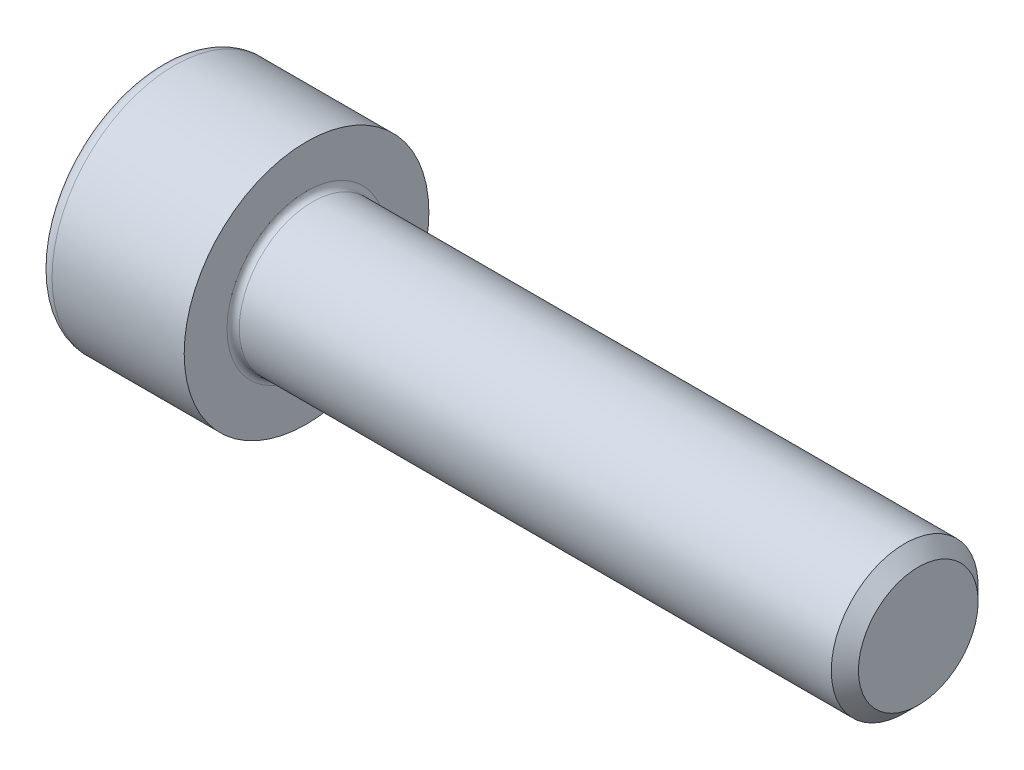
ISO-10303-21;
HEADER;
FILE_DESCRIPTION(('STEP AP214'),'2;1');
FILE_NAME('part.step','',(''),(''),'','','');
FILE_SCHEMA(('AUTOMOTIVE_DESIGN { 1 0 10303 214 1 1 1 1 }'));
ENDSEC;
DATA;
#1=APPLICATION_CONTEXT('core data for automotive mechanical design processes');
#2=APPLICATION_PROTOCOL_DEFINITION('international standard','automotive_design',2000,#1);
#3=PRODUCT_CONTEXT('',#1,'mechanical');
#4=PRODUCT('Part','Part','',(#3));
#5=PRODUCT_RELATED_PRODUCT_CATEGORY('part','',(#4));
#6=PRODUCT_DEFINITION_FORMATION('','',#4);
#7=PRODUCT_DEFINITION_CONTEXT('part definition',#1,'design');
#8=PRODUCT_DEFINITION('design','',#6,#7);
#9=PRODUCT_DEFINITION_SHAPE('','',#8);
#10=(LENGTH_UNIT() NAMED_UNIT(*) SI_UNIT(.MILLI.,.METRE.));
#11=(NAMED_UNIT(*) PLANE_ANGLE_UNIT() SI_UNIT($,.RADIAN.));
#12=(NAMED_UNIT(*) SI_UNIT($,.STERADIAN.) SOLID_ANGLE_UNIT());
#13=UNCERTAINTY_MEASURE_WITH_UNIT(LENGTH_MEASURE(1.E-05),#10,'distance_accuracy_value','');
#14=(GEOMETRIC_REPRESENTATION_CONTEXT(3) GLOBAL_UNCERTAINTY_ASSIGNED_CONTEXT((#13)) GLOBAL_UNIT_ASSIGNED_CONTEXT((#10,
#11,#12)) REPRESENTATION_CONTEXT('',''));
#15=CARTESIAN_POINT('',(0.,0.,0.));
#16=DIRECTION('',(0.,0.,1.));
#17=DIRECTION('',(1.,0.,0.));
#18=AXIS2_PLACEMENT_3D('',#15,#16,#17);
#19=CARTESIAN_POINT('',(3.00000000000064,2.89829835133248,0.));
#20=DIRECTION('',(1.,0.,0.));
#21=DIRECTION('',(0.,0.,-1.));
#22=AXIS2_PLACEMENT_3D('',#19,#20,#21);
#23=PLANE('',#22);
#24=DIRECTION('',(0.,1.,0.));
#25=VECTOR('',#24,1.);
#26=CARTESIAN_POINT('',(3.00000000000064,2.89829835133248,2.51000000000023));
#27=LINE('',#26,#25);
#28=CARTESIAN_POINT('',(2.99999999999321,5.33466170543264E-13,2.50999999995794));
#29=VERTEX_POINT('',#28);
#30=CARTESIAN_POINT('',(3.00000000000058,-1.4491491756657,2.51000000000001));
#31=VERTEX_POINT('',#30);
#32=EDGE_CURVE('E101',#29,#31,#27,.F.);
#33=ORIENTED_EDGE('',*,*,#32,.F.);
#34=CARTESIAN_POINT('',(2.99999999997711,4.99600361081315E-13,2.22044604925031E-13));
#35=DIRECTION('',(-1.,0.,0.));
#36=DIRECTION('',(0.,-1.,0.));
#37=AXIS2_PLACEMENT_3D('',#34,#35,#36);
#38=CIRCLE('',#37,2.50999999991541);
#39=CARTESIAN_POINT('',(2.99999999998888,-2.17372376346207,1.25499999997868));
#40=VERTEX_POINT('',#39);
#41=EDGE_CURVE('E103',#29,#40,#38,.F.);
#42=ORIENTED_EDGE('',*,*,#41,.T.);
#43=DIRECTION('',(0.,-0.499999999999969,-0.866025403784456));
#44=VECTOR('',#43,1.);
#45=CARTESIAN_POINT('',(3.00000000000064,-1.44914917566558,2.51000000000023));
#46=LINE('',#45,#44);
#47=EDGE_CURVE('E106',#31,#40,#46,.T.);
#48=ORIENTED_EDGE('',*,*,#47,.F.);
#49=EDGE_LOOP('',(#33,#42,#48));
#50=FACE_BOUND('',#49,.T.);
#51=ADVANCED_FACE('F16',(#50),#23,.F.);
#52=CARTESIAN_POINT('',(3.00000000000064,2.89829835133248,0.));
#53=DIRECTION('',(1.,0.,0.));
#54=DIRECTION('',(0.,0.,-1.));
#55=AXIS2_PLACEMENT_3D('',#52,#53,#54);
#56=PLANE('',#55);
#57=DIRECTION('',(0.,-0.499999999999884,-0.866025403784506));
#58=VECTOR('',#57,1.);
#59=CARTESIAN_POINT('',(3.00000000000064,-2.17372376349872,1.25499999999984));
#60=LINE('',#59,#58);
#61=CARTESIAN_POINT('',(3.00000000000064,-2.89829835133147,-1.87410157169614E-13));
#62=VERTEX_POINT('',#61);
#63=EDGE_CURVE('E175',#40,#62,#60,.T.);
#64=ORIENTED_EDGE('',*,*,#63,.F.);
#65=CARTESIAN_POINT('',(2.99999999997711,4.99600361081315E-13,2.22044604925031E-13));
#66=DIRECTION('',(-1.,0.,0.));
#67=DIRECTION('',(0.,-1.,0.));
#68=AXIS2_PLACEMENT_3D('',#65,#66,#67);
#69=CIRCLE('',#68,2.50999999991541);
#70=CARTESIAN_POINT('',(2.99999999994429,-2.17372376346173,-1.25499999997916));
#71=VERTEX_POINT('',#70);
#72=EDGE_CURVE('E121',#40,#71,#69,.F.);
#73=ORIENTED_EDGE('',*,*,#72,.T.);
#74=DIRECTION('',(0.,0.499999999999918,-0.866025403784486));
#75=VECTOR('',#74,1.);
#76=CARTESIAN_POINT('',(3.00000000000064,-2.89829835133149,-1.66533453693773E-13));
#77=LINE('',#76,#75);
#78=EDGE_CURVE('E171',#62,#71,#77,.T.);
#79=ORIENTED_EDGE('',*,*,#78,.F.);
#80=EDGE_LOOP('',(#64,#73,#79));
#81=FACE_BOUND('',#80,.T.);
#82=ADVANCED_FACE('F367',(#81),#56,.F.);
#83=CARTESIAN_POINT('',(3.00000000000064,2.89829835133248,0.));
#84=DIRECTION('',(1.,0.,0.));
#85=DIRECTION('',(0.,0.,-1.));
#86=AXIS2_PLACEMENT_3D('',#83,#84,#85);
#87=PLANE('',#86);
#88=DIRECTION('',(0.,0.500000000000312,-0.866025403784258));
#89=VECTOR('',#88,1.);
#90=CARTESIAN_POINT('',(3.00000000000064,-2.17372376349872,-1.25500000000006));
#91=LINE('',#90,#89);
#92=CARTESIAN_POINT('',(3.00000000000064,-1.4491491756653,-2.50999999999976));
#93=VERTEX_POINT('',#92);
#94=EDGE_CURVE('E167',#71,#93,#91,.T.);
#95=ORIENTED_EDGE('',*,*,#94,.F.);
#96=CARTESIAN_POINT('',(2.99999999991147,4.99600361081309E-13,2.22044604925031E-13));
#97=DIRECTION('',(-1.,0.,0.));
#98=DIRECTION('',(0.,-1.,0.));
#99=AXIS2_PLACEMENT_3D('',#96,#97,#98);
#100=CIRCLE('',#99,2.5100000000291);
#101=CARTESIAN_POINT('',(2.99999999994869,5.55648123354904E-13,-2.50999999997203));
#102=VERTEX_POINT('',#101);
#103=EDGE_CURVE('E221',#71,#102,#100,.F.);
#104=ORIENTED_EDGE('',*,*,#103,.T.);
#105=DIRECTION('',(0.,1.,0.));
#106=VECTOR('',#105,1.);
#107=CARTESIAN_POINT('',(3.00000000000064,2.89829835133248,-2.50999999999979));
#108=LINE('',#107,#106);
#109=EDGE_CURVE('E163',#93,#102,#108,.T.);
#110=ORIENTED_EDGE('',*,*,#109,.F.);
#111=EDGE_LOOP('',(#95,#104,#110));
#112=FACE_BOUND('',#111,.T.);
#113=ADVANCED_FACE('F361',(#112),#87,.F.);
#114=CARTESIAN_POINT('',(3.00000000000064,2.89829835133248,0.));
#115=DIRECTION('',(1.,0.,0.));
#116=DIRECTION('',(0.,0.,-1.));
#117=AXIS2_PLACEMENT_3D('',#114,#115,#116);
#118=PLANE('',#117);
#119=DIRECTION('',(0.,1.,0.));
#120=VECTOR('',#119,1.);
#121=CARTESIAN_POINT('',(3.00000000000064,2.89829835133248,-2.50999999999979));
#122=LINE('',#121,#120);
#123=CARTESIAN_POINT('',(3.00000000000064,1.4491491756666,-2.50999999999976));
#124=VERTEX_POINT('',#123);
#125=EDGE_CURVE('E159',#102,#124,#122,.T.);
#126=ORIENTED_EDGE('',*,*,#125,.F.);
#127=CARTESIAN_POINT('',(3.00000000000113,4.9960036108132E-13,2.22044604925031E-13));
#128=DIRECTION('',(-1.,0.,0.));
#129=DIRECTION('',(0.,0.,1.));
#130=AXIS2_PLACEMENT_3D('',#127,#128,#129);
#131=CIRCLE('',#130,2.50999999991541);
#132=CARTESIAN_POINT('',(3.00000000000089,2.1737237634627,-1.25499999997872));
#133=VERTEX_POINT('',#132);
#134=EDGE_CURVE('E218',#102,#133,#131,.F.);
#135=ORIENTED_EDGE('',*,*,#134,.T.);
#136=DIRECTION('',(0.,0.499999999999877,0.86602540378451));
#137=VECTOR('',#136,1.);
#138=CARTESIAN_POINT('',(3.00000000000064,1.44914917566663,-2.50999999999968));
#139=LINE('',#138,#137);
#140=EDGE_CURVE('E155',#124,#133,#139,.T.);
#141=ORIENTED_EDGE('',*,*,#140,.F.);
#142=EDGE_LOOP('',(#126,#135,#141));
#143=FACE_BOUND('',#142,.T.);
#144=ADVANCED_FACE('F353',(#143),#118,.F.);
#145=CARTESIAN_POINT('',(3.00000000000064,2.89829835133248,0.));
#146=DIRECTION('',(1.,0.,0.));
#147=DIRECTION('',(0.,0.,-1.));
#148=AXIS2_PLACEMENT_3D('',#145,#146,#147);
#149=PLANE('',#148);
#150=DIRECTION('',(0.,0.500000000000164,0.866025403784344));
#151=VECTOR('',#150,1.);
#152=CARTESIAN_POINT('',(3.00000000000064,2.17372376349928,-1.25499999999984));
#153=LINE('',#152,#151);
#154=CARTESIAN_POINT('',(3.00000000000064,2.89829835133239,-1.55405760932026E-13));
#155=VERTEX_POINT('',#154);
#156=EDGE_CURVE('E151',#133,#155,#153,.T.);
#157=ORIENTED_EDGE('',*,*,#156,.F.);
#158=CARTESIAN_POINT('',(3.00000000000113,4.9960036108132E-13,2.22044604925031E-13));
#159=DIRECTION('',(-1.,0.,0.));
#160=DIRECTION('',(0.,0.,1.));
#161=AXIS2_PLACEMENT_3D('',#158,#159,#160);
#162=CIRCLE('',#161,2.50999999991541);
#163=CARTESIAN_POINT('',(3.00000000000113,2.17372376346279,1.25499999997908));
#164=VERTEX_POINT('',#163);
#165=EDGE_CURVE('E129',#133,#164,#162,.F.);
#166=ORIENTED_EDGE('',*,*,#165,.T.);
#167=DIRECTION('',(0.,-0.500000000000167,0.866025403784342));
#168=VECTOR('',#167,1.);
#169=CARTESIAN_POINT('',(3.00000000000064,2.89829835133248,0.));
#170=LINE('',#169,#168);
#171=EDGE_CURVE('E122',#155,#164,#170,.T.);
#172=ORIENTED_EDGE('',*,*,#171,.F.);
#173=EDGE_LOOP('',(#157,#166,#172));
#174=FACE_BOUND('',#173,.T.);
#175=ADVANCED_FACE('F349',(#174),#149,.F.);
#176=CARTESIAN_POINT('',(3.00000000009959,4.9960036108132E-13,2.22044604925031E-13));
#177=DIRECTION('',(-1.,0.,0.));
#178=DIRECTION('',(0.,0.,1.));
#179=AXIS2_PLACEMENT_3D('',#176,#177,#178);
#180=CONICAL_SURFACE('',#179,2.50999999974488,1.04719755108399);
#181=CARTESIAN_POINT('',(4.44914917579808,4.99600361077281E-13,-3.41060513164848E-10));
#182=VERTEX_POINT('',#181);
#183=VERTEX_LOOP('',#182);
#184=FACE_BOUND('',#183,.T.);
#185=ORIENTED_EDGE('',*,*,#41,.F.);
#186=CARTESIAN_POINT('',(3.00000000000113,4.9960036108132E-13,2.22044604925031E-13));
#187=DIRECTION('',(-1.,0.,0.));
#188=DIRECTION('',(0.,0.,1.));
#189=AXIS2_PLACEMENT_3D('',#186,#187,#188);
#190=CIRCLE('',#189,2.50999999991541);
#191=EDGE_CURVE('E117',#29,#164,#190,.T.);
#192=ORIENTED_EDGE('',*,*,#191,.T.);
#193=ORIENTED_EDGE('',*,*,#165,.F.);
#194=ORIENTED_EDGE('',*,*,#134,.F.);
#195=ORIENTED_EDGE('',*,*,#103,.F.);
#196=ORIENTED_EDGE('',*,*,#72,.F.);
#197=EDGE_LOOP('',(#185,#192,#193,#194,#195,#196));
#198=FACE_BOUND('',#197,.T.);
#199=ADVANCED_FACE('F115',(#184,#198),#180,.F.);
#200=CARTESIAN_POINT('',(3.00000000000064,2.89829835133248,0.));
#201=DIRECTION('',(1.,0.,0.));
#202=DIRECTION('',(0.,0.,-1.));
#203=AXIS2_PLACEMENT_3D('',#200,#201,#202);
#204=PLANE('',#203);
#205=DIRECTION('',(0.,0.49999999999999,-0.866025403784445));
#206=VECTOR('',#205,1.);
#207=CARTESIAN_POINT('',(3.00000000000028,2.89829835133248,0.));
#208=LINE('',#207,#206);
#209=CARTESIAN_POINT('',(3.0000000000004,1.44914917566631,2.51000000000031));
#210=VERTEX_POINT('',#209);
#211=EDGE_CURVE('E128',#164,#210,#208,.F.);
#212=ORIENTED_EDGE('',*,*,#211,.F.);
#213=ORIENTED_EDGE('',*,*,#191,.F.);
#214=DIRECTION('',(0.,-1.,0.));
#215=VECTOR('',#214,1.);
#216=CARTESIAN_POINT('',(3.00000000000039,-1.44914917566558,2.51000000000023));
#217=LINE('',#216,#215);
#218=EDGE_CURVE('E126',#29,#210,#217,.F.);
#219=ORIENTED_EDGE('',*,*,#218,.T.);
#220=EDGE_LOOP('',(#212,#213,#219));
#221=FACE_BOUND('',#220,.T.);
#222=ADVANCED_FACE('F125',(#221),#204,.F.);
#223=CARTESIAN_POINT('',(3.00000000000064,2.89829835133248,0.));
#224=DIRECTION('',(0.,-0.866025403784445,-0.49999999999999));
#225=DIRECTION('',(0.,0.49999999999999,-0.866025403784445));
#226=AXIS2_PLACEMENT_3D('',#223,#224,#225);
#227=PLANE('',#226);
#228=ORIENTED_EDGE('',*,*,#211,.T.);
#229=DIRECTION('',(1.,0.,0.));
#230=VECTOR('',#229,1.);
#231=CARTESIAN_POINT('',(3.00000000000006,1.4491491756663,2.51000000000027));
#232=LINE('',#231,#230);
#233=CARTESIAN_POINT('',(0.,1.4491491756662,2.5100000000003));
#234=VERTEX_POINT('',#233);
#235=EDGE_CURVE('E134',#210,#234,#232,.F.);
#236=ORIENTED_EDGE('',*,*,#235,.T.);
#237=DIRECTION('',(0.,-0.49999999999998,0.86602540378445));
#238=VECTOR('',#237,1.);
#239=CARTESIAN_POINT('',(0.,2.89829835133198,-3.33066907387547E-13));
#240=LINE('',#239,#238);
#241=CARTESIAN_POINT('',(0.,2.8982983513323,-2.1661995548628E-13));
#242=VERTEX_POINT('',#241);
#243=EDGE_CURVE('E194',#242,#234,#240,.T.);
#244=ORIENTED_EDGE('',*,*,#243,.F.);
#245=DIRECTION('',(1.,0.,0.));
#246=VECTOR('',#245,1.);
#247=CARTESIAN_POINT('',(3.00000000000064,2.89829835133222,-4.66217282796079E-13));
#248=LINE('',#247,#246);
#249=EDGE_CURVE('E186',#242,#155,#248,.T.);
#250=ORIENTED_EDGE('',*,*,#249,.T.);
#251=ORIENTED_EDGE('',*,*,#171,.T.);
#252=EDGE_LOOP('',(#228,#236,#244,#250,#251));
#253=FACE_BOUND('',#252,.T.);
#254=ADVANCED_FACE('F342',(#253),#227,.T.);
#255=CARTESIAN_POINT('',(3.00000000000006,-1.44914917566558,2.51000000000023));
#256=DIRECTION('',(0.,0.,1.));
#257=DIRECTION('',(0.,-1.,0.));
#258=AXIS2_PLACEMENT_3D('',#255,#256,#257);
#259=PLANE('',#258);
#260=ORIENTED_EDGE('',*,*,#235,.F.);
#261=ORIENTED_EDGE('',*,*,#218,.F.);
#262=ORIENTED_EDGE('',*,*,#32,.T.);
#263=DIRECTION('',(1.,0.,0.));
#264=VECTOR('',#263,1.);
#265=CARTESIAN_POINT('',(3.00000000000006,-1.44914917566596,2.50999999999956));
#266=LINE('',#265,#264);
#267=CARTESIAN_POINT('',(-1.52655665885959E-13,-1.44914917566623,2.51000000000001));
#268=VERTEX_POINT('',#267);
#269=EDGE_CURVE('E136',#268,#31,#266,.T.);
#270=ORIENTED_EDGE('',*,*,#269,.F.);
#271=DIRECTION('',(0.,1.,0.));
#272=VECTOR('',#271,1.);
#273=CARTESIAN_POINT('',(0.,0.,2.51));
#274=LINE('',#273,#272);
#275=EDGE_CURVE('E337',#234,#268,#274,.F.);
#276=ORIENTED_EDGE('',*,*,#275,.F.);
#277=EDGE_LOOP('',(#260,#261,#262,#270,#276));
#278=FACE_BOUND('',#277,.T.);
#279=ADVANCED_FACE('F132',(#278),#259,.F.);
#280=CARTESIAN_POINT('',(3.00000000000006,-1.44914917566558,2.51000000000023));
#281=DIRECTION('',(0.,0.866025403784437,-0.500000000000003));
#282=DIRECTION('',(0.,0.500000000000003,0.866025403784437));
#283=AXIS2_PLACEMENT_3D('',#280,#281,#282);
#284=PLANE('',#283);
#285=ORIENTED_EDGE('',*,*,#63,.T.);
#286=DIRECTION('',(1.,0.,0.));
#287=VECTOR('',#286,1.);
#288=CARTESIAN_POINT('',(2.9999999999995,-2.89829835133145,-2.28784093360925E-13));
#289=LINE('',#288,#287);
#290=CARTESIAN_POINT('',(-2.63677968348475E-13,-2.89829835133177,-2.42959863435398E-13));
#291=VERTEX_POINT('',#290);
#292=EDGE_CURVE('E198',#291,#62,#289,.T.);
#293=ORIENTED_EDGE('',*,*,#292,.F.);
#294=DIRECTION('',(0.,-0.499999999999904,-0.866025403784494));
#295=VECTOR('',#294,1.);
#296=CARTESIAN_POINT('',(0.,-1.44914917566635,2.50999999999979));
#297=LINE('',#296,#295);
#298=EDGE_CURVE('E334',#268,#291,#297,.T.);
#299=ORIENTED_EDGE('',*,*,#298,.F.);
#300=ORIENTED_EDGE('',*,*,#269,.T.);
#301=ORIENTED_EDGE('',*,*,#47,.T.);
#302=EDGE_LOOP('',(#285,#293,#299,#300,#301));
#303=FACE_BOUND('',#302,.T.);
#304=ADVANCED_FACE('F369',(#303),#284,.T.);
#305=CARTESIAN_POINT('',(2.9999999999995,-2.89829835133149,-1.66533453693773E-13));
#306=DIRECTION('',(0.,0.866025403784445,0.49999999999999));
#307=DIRECTION('',(0.,-0.49999999999999,0.866025403784445));
#308=AXIS2_PLACEMENT_3D('',#305,#306,#307);
#309=PLANE('',#308);
#310=ORIENTED_EDGE('',*,*,#94,.T.);
#311=DIRECTION('',(1.,0.,0.));
#312=VECTOR('',#311,1.);
#313=CARTESIAN_POINT('',(2.99999999999995,-1.4491491756653,-2.50999999999971));
#314=LINE('',#313,#312);
#315=CARTESIAN_POINT('',(0.,-1.44914917566558,-2.51));
#316=VERTEX_POINT('',#315);
#317=EDGE_CURVE('E190',#93,#316,#314,.F.);
#318=ORIENTED_EDGE('',*,*,#317,.T.);
#319=DIRECTION('',(0.,0.500000000000201,-0.866025403784323));
#320=VECTOR('',#319,1.);
#321=CARTESIAN_POINT('',(0.,-2.89829835133221,-6.66133814775094E-13));
#322=LINE('',#321,#320);
#323=EDGE_CURVE('E329',#291,#316,#322,.T.);
#324=ORIENTED_EDGE('',*,*,#323,.F.);
#325=ORIENTED_EDGE('',*,*,#292,.T.);
#326=ORIENTED_EDGE('',*,*,#78,.T.);
#327=EDGE_LOOP('',(#310,#318,#324,#325,#326));
#328=FACE_BOUND('',#327,.T.);
#329=ADVANCED_FACE('F363',(#328),#309,.T.);
#330=CARTESIAN_POINT('',(2.99999999999995,1.44914917566663,-2.50999999999968));
#331=DIRECTION('',(0.,0.,-1.));
#332=DIRECTION('',(0.,1.,0.));
#333=AXIS2_PLACEMENT_3D('',#330,#331,#332);
#334=PLANE('',#333);
#335=ORIENTED_EDGE('',*,*,#317,.F.);
#336=ORIENTED_EDGE('',*,*,#109,.T.);
#337=ORIENTED_EDGE('',*,*,#125,.T.);
#338=DIRECTION('',(1.,0.,0.));
#339=VECTOR('',#338,1.);
#340=CARTESIAN_POINT('',(3.00000000000064,1.44914917566668,-2.50999999999971));
#341=LINE('',#340,#339);
#342=CARTESIAN_POINT('',(0.,1.44914917566623,-2.50999999999984));
#343=VERTEX_POINT('',#342);
#344=EDGE_CURVE('E189',#124,#343,#341,.F.);
#345=ORIENTED_EDGE('',*,*,#344,.T.);
#346=DIRECTION('',(0.,1.,0.));
#347=VECTOR('',#346,1.);
#348=CARTESIAN_POINT('',(0.,0.,-2.51000000000029));
#349=LINE('',#348,#347);
#350=EDGE_CURVE('E325',#316,#343,#349,.T.);
#351=ORIENTED_EDGE('',*,*,#350,.F.);
#352=EDGE_LOOP('',(#335,#336,#337,#345,#351));
#353=FACE_BOUND('',#352,.T.);
#354=ADVANCED_FACE('F356',(#353),#334,.F.);
#355=CARTESIAN_POINT('',(3.00000000000064,2.89829835133248,0.));
#356=DIRECTION('',(0.,0.866025403784436,-0.500000000000004));
#357=DIRECTION('',(0.,0.500000000000004,0.866025403784436));
#358=AXIS2_PLACEMENT_3D('',#355,#356,#357);
#359=PLANE('',#358);
#360=ORIENTED_EDGE('',*,*,#344,.F.);
#361=ORIENTED_EDGE('',*,*,#140,.T.);
#362=ORIENTED_EDGE('',*,*,#156,.T.);
#363=ORIENTED_EDGE('',*,*,#249,.F.);
#364=DIRECTION('',(0.,0.500000000000018,0.866025403784428));
#365=VECTOR('',#364,1.);
#366=CARTESIAN_POINT('',(0.,1.44914917566613,-2.51000000000003));
#367=LINE('',#366,#365);
#368=EDGE_CURVE('E323',#343,#242,#367,.T.);
#369=ORIENTED_EDGE('',*,*,#368,.F.);
#370=EDGE_LOOP('',(#360,#361,#362,#363,#369));
#371=FACE_BOUND('',#370,.T.);
#372=ADVANCED_FACE('F299',(#371),#359,.F.);
#373=CARTESIAN_POINT('',(0.,0.,0.));
#374=DIRECTION('',(-1.,0.,0.));
#375=DIRECTION('',(0.,0.,1.));
#376=AXIS2_PLACEMENT_3D('',#373,#374,#375);
#377=PLANE('',#376);
#378=CARTESIAN_POINT('',(0.,0.,0.));
#379=DIRECTION('',(1.,0.,0.));
#380=DIRECTION('',(0.,0.,-1.));
#381=AXIS2_PLACEMENT_3D('',#378,#379,#380);
#382=CIRCLE('',#381,4.4);
#383=CARTESIAN_POINT('',(0.,0.,-4.40000000000002));
#384=VERTEX_POINT('',#383);
#385=CARTESIAN_POINT('',(0.,0.,4.40000000000006));
#386=VERTEX_POINT('',#385);
#387=EDGE_CURVE('E320',#384,#386,#382,.T.);
#388=ORIENTED_EDGE('',*,*,#387,.F.);
#389=CARTESIAN_POINT('',(0.,0.,0.));
#390=DIRECTION('',(1.,0.,0.));
#391=DIRECTION('',(0.,0.,1.));
#392=AXIS2_PLACEMENT_3D('',#389,#390,#391);
#393=CIRCLE('',#392,4.40000000000005);
#394=EDGE_CURVE('E318',#386,#384,#393,.T.);
#395=ORIENTED_EDGE('',*,*,#394,.F.);
#396=EDGE_LOOP('',(#388,#395));
#397=FACE_BOUND('',#396,.T.);
#398=ORIENTED_EDGE('',*,*,#350,.T.);
#399=ORIENTED_EDGE('',*,*,#368,.T.);
#400=ORIENTED_EDGE('',*,*,#243,.T.);
#401=ORIENTED_EDGE('',*,*,#275,.T.);
#402=ORIENTED_EDGE('',*,*,#298,.T.);
#403=ORIENTED_EDGE('',*,*,#323,.T.);
#404=EDGE_LOOP('',(#398,#399,#400,#401,#402,#403));
#405=FACE_BOUND('',#404,.T.);
#406=ADVANCED_FACE('F293',(#397,#405),#377,.T.);
#407=CARTESIAN_POINT('',(0.599999999999989,0.,0.));
#408=DIRECTION('',(-1.,0.,0.));
#409=DIRECTION('',(0.,0.,1.));
#410=AXIS2_PLACEMENT_3D('',#407,#408,#409);
#411=TOROIDAL_SURFACE('',#410,4.4,0.6);
#412=CARTESIAN_POINT('',(0.599999999999989,0.,1.60982338570648E-12));
#413=DIRECTION('',(-1.,0.,0.));
#414=DIRECTION('',(0.,0.,1.));
#415=AXIS2_PLACEMENT_3D('',#412,#413,#414);
#416=CIRCLE('',#415,5.00000000000012);
#417=CARTESIAN_POINT('',(0.599999999999989,0.,5.00000000000173));
#418=VERTEX_POINT('',#417);
#419=EDGE_CURVE('E214',#418,#418,#416,.F.);
#420=ORIENTED_EDGE('',*,*,#419,.F.);
#421=EDGE_LOOP('',(#420));
#422=FACE_BOUND('',#421,.T.);
#423=ORIENTED_EDGE('',*,*,#394,.T.);
#424=ORIENTED_EDGE('',*,*,#387,.T.);
#425=EDGE_LOOP('',(#423,#424));
#426=FACE_BOUND('',#425,.T.);
#427=ADVANCED_FACE('F288',(#422,#426),#411,.T.);
#428=CARTESIAN_POINT('',(-31.7499999999999,0.,1.60982338570648E-12));
#429=DIRECTION('',(-1.,0.,0.));
#430=DIRECTION('',(0.,0.,1.));
#431=AXIS2_PLACEMENT_3D('',#428,#429,#430);
#432=CYLINDRICAL_SURFACE('',#431,5.00000000000012);
#433=CARTESIAN_POINT('',(5.99999999999995,0.,1.60982338570648E-12));
#434=DIRECTION('',(-1.,0.,0.));
#435=DIRECTION('',(0.,0.,1.));
#436=AXIS2_PLACEMENT_3D('',#433,#434,#435);
#437=CIRCLE('',#436,5.00000000000012);
#438=CARTESIAN_POINT('',(5.99999999999995,0.,5.00000000000173));
#439=VERTEX_POINT('',#438);
#440=EDGE_CURVE('E212',#439,#439,#437,.F.);
#441=ORIENTED_EDGE('',*,*,#440,.F.);
#442=EDGE_LOOP('',(#441));
#443=FACE_BOUND('',#442,.T.);
#444=ORIENTED_EDGE('',*,*,#419,.T.);
#445=EDGE_LOOP('',(#444));
#446=FACE_BOUND('',#445,.T.);
#447=ADVANCED_FACE('F292',(#443,#446),#432,.T.);
#448=CARTESIAN_POINT('',(31.0000000000008,2.44550000000021,6.66133814775094E-13));
#449=DIRECTION('',(1.,0.,0.));
#450=DIRECTION('',(0.,0.,-1.));
#451=AXIS2_PLACEMENT_3D('',#448,#449,#450);
#452=PLANE('',#451);
#453=CARTESIAN_POINT('',(31.0000000000059,2.77555756156289E-13,7.21644966006352E-13));
#454=DIRECTION('',(-1.,0.,0.));
#455=DIRECTION('',(0.,0.,1.));
#456=AXIS2_PLACEMENT_3D('',#453,#454,#455);
#457=CIRCLE('',#456,2.44550000002092);
#458=CARTESIAN_POINT('',(31.0000000000059,2.77555756156289E-13,2.44550000002164));
#459=VERTEX_POINT('',#458);
#460=EDGE_CURVE('E208',#459,#459,#457,.T.);
#461=ORIENTED_EDGE('',*,*,#460,.F.);
#462=EDGE_LOOP('',(#461));
#463=FACE_BOUND('',#462,.T.);
#464=ADVANCED_FACE('F265',(#463),#452,.T.);
#465=CARTESIAN_POINT('',(5.99999999999951,4.99999999999995,3.12250225675825E-12));
#466=DIRECTION('',(1.,0.,0.));
#467=DIRECTION('',(0.,0.,-1.));
#468=AXIS2_PLACEMENT_3D('',#465,#466,#467);
#469=PLANE('',#468);
#470=ORIENTED_EDGE('',*,*,#440,.T.);
#471=EDGE_LOOP('',(#470));
#472=FACE_BOUND('',#471,.T.);
#473=CARTESIAN_POINT('',(5.99999999999992,2.77555756156289E-13,2.34534613952064E-12));
#474=DIRECTION('',(1.,0.,0.));
#475=DIRECTION('',(0.,0.,1.));
#476=AXIS2_PLACEMENT_3D('',#473,#474,#475);
#477=CIRCLE('',#476,3.25000000000002);
#478=CARTESIAN_POINT('',(5.99999999999976,2.34121055875391E-13,-3.24999999999771));
#479=VERTEX_POINT('',#478);
#480=CARTESIAN_POINT('',(5.99999999999976,1.05660033429111E-13,3.25000000000244));
#481=VERTEX_POINT('',#480);
#482=EDGE_CURVE('E211',#479,#481,#477,.F.);
#483=ORIENTED_EDGE('',*,*,#482,.T.);
#484=CARTESIAN_POINT('',(5.99999999999992,2.77555756156289E-13,2.34534613952064E-12));
#485=DIRECTION('',(1.,0.,0.));
#486=DIRECTION('',(0.,0.,-1.));
#487=AXIS2_PLACEMENT_3D('',#484,#485,#486);
#488=CIRCLE('',#487,3.25000000000013);
#489=EDGE_CURVE('E35',#481,#479,#488,.F.);
#490=ORIENTED_EDGE('',*,*,#489,.T.);
#491=EDGE_LOOP('',(#483,#490));
#492=FACE_BOUND('',#491,.T.);
#493=ADVANCED_FACE('F256',(#472,#492),#469,.T.);
#494=CARTESIAN_POINT('',(30.4455000000416,2.77555756156289E-13,7.21644966006352E-13));
#495=DIRECTION('',(-1.,0.,0.));
#496=DIRECTION('',(0.,0.,1.));
#497=AXIS2_PLACEMENT_3D('',#494,#495,#496);
#498=CONICAL_SURFACE('',#497,2.99999999998518,0.785398163397448);
#499=CARTESIAN_POINT('',(30.4455,0.,1.60982338570648E-12));
#500=DIRECTION('',(-1.,0.,0.));
#501=DIRECTION('',(0.,0.,1.));
#502=AXIS2_PLACEMENT_3D('',#499,#500,#501);
#503=CIRCLE('',#502,3.00000000000007);
#504=CARTESIAN_POINT('',(30.4455,0.,3.00000000000168));
#505=VERTEX_POINT('',#504);
#506=EDGE_CURVE('E27',#505,#505,#503,.T.);
#507=ORIENTED_EDGE('',*,*,#506,.F.);
#508=EDGE_LOOP('',(#507));
#509=FACE_BOUND('',#508,.T.);
#510=ORIENTED_EDGE('',*,*,#460,.T.);
#511=EDGE_LOOP('',(#510));
#512=FACE_BOUND('',#511,.T.);
#513=ADVANCED_FACE('F242',(#509,#512),#498,.T.);
#514=CARTESIAN_POINT('',(6.24999999999992,2.77555756156289E-13,2.34534613952064E-12));
#515=DIRECTION('',(1.,0.,0.));
#516=DIRECTION('',(0.,0.,-1.));
#517=AXIS2_PLACEMENT_3D('',#514,#515,#516);
#518=TOROIDAL_SURFACE('',#517,3.25,0.25);
#519=CARTESIAN_POINT('',(6.24999999999992,0.,1.60982338570648E-12));
#520=DIRECTION('',(-1.,0.,0.));
#521=DIRECTION('',(0.,0.,1.));
#522=AXIS2_PLACEMENT_3D('',#519,#520,#521);
#523=CIRCLE('',#522,3.00000000000007);
#524=CARTESIAN_POINT('',(6.24999999999992,0.,3.00000000000168));
#525=VERTEX_POINT('',#524);
#526=EDGE_CURVE('E11',#525,#525,#523,.F.);
#527=ORIENTED_EDGE('',*,*,#526,.F.);
#528=EDGE_LOOP('',(#527));
#529=FACE_BOUND('',#528,.T.);
#530=ORIENTED_EDGE('',*,*,#482,.F.);
#531=ORIENTED_EDGE('',*,*,#489,.F.);
#532=EDGE_LOOP('',(#530,#531));
#533=FACE_BOUND('',#532,.T.);
#534=ADVANCED_FACE('F230',(#529,#533),#518,.F.);
#535=CARTESIAN_POINT('',(-31.7499999999999,0.,1.60982338570648E-12));
#536=DIRECTION('',(-1.,0.,0.));
#537=DIRECTION('',(0.,0.,1.));
#538=AXIS2_PLACEMENT_3D('',#535,#536,#537);
#539=CYLINDRICAL_SURFACE('',#538,3.00000000000007);
#540=ORIENTED_EDGE('',*,*,#526,.T.);
#541=EDGE_LOOP('',(#540));
#542=FACE_BOUND('',#541,.T.);
#543=ORIENTED_EDGE('',*,*,#506,.T.);
#544=EDGE_LOOP('',(#543));
#545=FACE_BOUND('',#544,.T.);
#546=ADVANCED_FACE('F241',(#542,#545),#539,.T.);
#547=CLOSED_SHELL('',(#51,#82,#113,#144,#175,#199,#222,#254,#279,#304,#329,#354,#372,#406,#427,
#447,#464,#493,#513,#534,#546));
#548=MANIFOLD_SOLID_BREP('B1',#547);
#549=ADVANCED_BREP_SHAPE_REPRESENTATION('',(#18,#548),#14);
#550=SHAPE_DEFINITION_REPRESENTATION(#9,#549);
ENDSEC;
END-ISO-10303-21;
